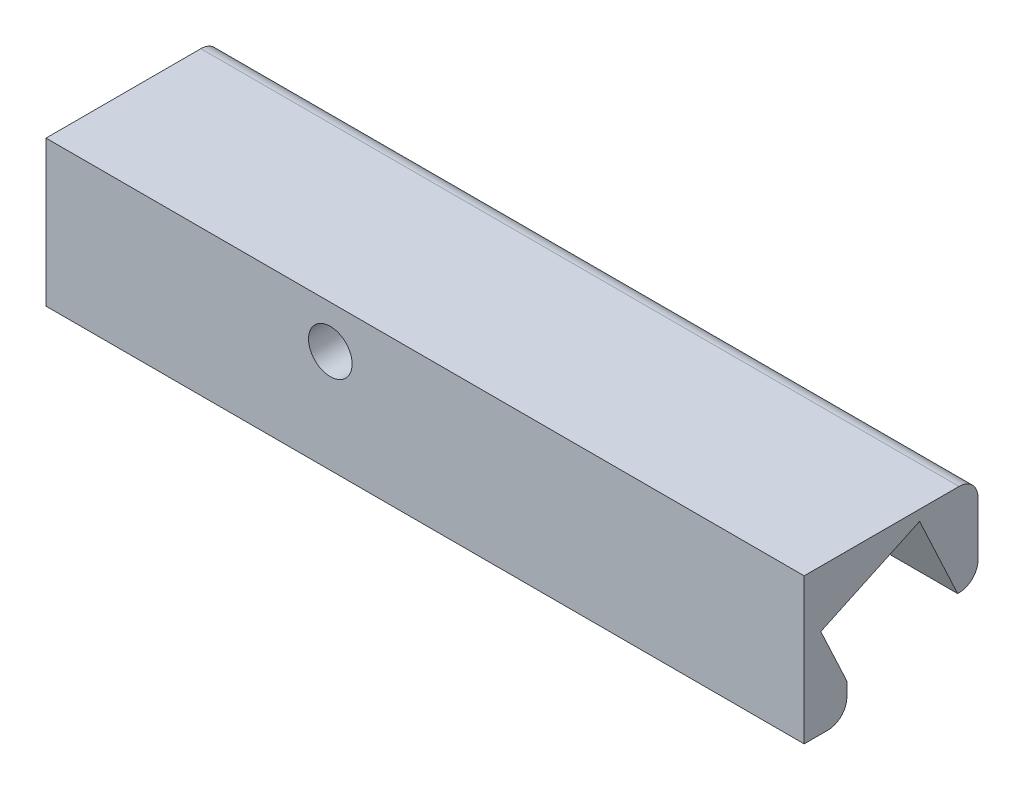
ISO-10303-21;
HEADER;
FILE_DESCRIPTION(('STEP AP214'),'2;1');
FILE_NAME('part.step','',(''),(''),'','','');
FILE_SCHEMA(('AUTOMOTIVE_DESIGN { 1 0 10303 214 1 1 1 1 }'));
ENDSEC;
DATA;
#1=APPLICATION_CONTEXT('core data for automotive mechanical design processes');
#2=APPLICATION_PROTOCOL_DEFINITION('international standard','automotive_design',2000,#1);
#3=PRODUCT_CONTEXT('',#1,'mechanical');
#4=PRODUCT('Part','Part','',(#3));
#5=PRODUCT_RELATED_PRODUCT_CATEGORY('part','',(#4));
#6=PRODUCT_DEFINITION_FORMATION('','',#4);
#7=PRODUCT_DEFINITION_CONTEXT('part definition',#1,'design');
#8=PRODUCT_DEFINITION('design','',#6,#7);
#9=PRODUCT_DEFINITION_SHAPE('','',#8);
#10=(LENGTH_UNIT() NAMED_UNIT(*) SI_UNIT(.MILLI.,.METRE.));
#11=(NAMED_UNIT(*) PLANE_ANGLE_UNIT() SI_UNIT($,.RADIAN.));
#12=(NAMED_UNIT(*) SI_UNIT($,.STERADIAN.) SOLID_ANGLE_UNIT());
#13=UNCERTAINTY_MEASURE_WITH_UNIT(LENGTH_MEASURE(1.E-05),#10,'distance_accuracy_value','');
#14=(GEOMETRIC_REPRESENTATION_CONTEXT(3) GLOBAL_UNCERTAINTY_ASSIGNED_CONTEXT((#13)) GLOBAL_UNIT_ASSIGNED_CONTEXT((#10,
#11,#12)) REPRESENTATION_CONTEXT('',''));
#15=CARTESIAN_POINT('',(0.,0.,0.));
#16=DIRECTION('',(0.,0.,1.));
#17=DIRECTION('',(1.,0.,0.));
#18=AXIS2_PLACEMENT_3D('',#15,#16,#17);
#19=CARTESIAN_POINT('',(80.,15.360110010018,0.));
#20=DIRECTION('',(0.,0.,-1.));
#21=DIRECTION('',(0.,1.,0.));
#22=AXIS2_PLACEMENT_3D('',#19,#20,#21);
#23=PLANE('',#22);
#24=CARTESIAN_POINT('',(30.,10.860110010018,0.));
#25=DIRECTION('',(0.,0.,1.));
#26=DIRECTION('',(1.,0.,0.));
#27=AXIS2_PLACEMENT_3D('',#24,#25,#26);
#28=CIRCLE('',#27,2.3);
#29=CARTESIAN_POINT('',(32.3,10.860110010018,0.));
#30=VERTEX_POINT('',#29);
#31=EDGE_CURVE('E246',#30,#30,#28,.T.);
#32=ORIENTED_EDGE('',*,*,#31,.F.);
#33=EDGE_LOOP('',(#32));
#34=FACE_BOUND('',#33,.T.);
#35=DIRECTION('',(0.,-1.,0.));
#36=VECTOR('',#35,1.);
#37=CARTESIAN_POINT('',(0.,15.360110010018,0.));
#38=LINE('',#37,#36);
#39=CARTESIAN_POINT('',(0.,15.360110010018,0.));
#40=VERTEX_POINT('',#39);
#41=CARTESIAN_POINT('',(0.,0.,0.));
#42=VERTEX_POINT('',#41);
#43=EDGE_CURVE('E153',#40,#42,#38,.T.);
#44=ORIENTED_EDGE('',*,*,#43,.T.);
#45=DIRECTION('',(-1.,0.,0.));
#46=VECTOR('',#45,1.);
#47=CARTESIAN_POINT('',(80.,0.,0.));
#48=LINE('',#47,#46);
#49=CARTESIAN_POINT('',(80.,0.,0.));
#50=VERTEX_POINT('',#49);
#51=EDGE_CURVE('E11',#50,#42,#48,.T.);
#52=ORIENTED_EDGE('',*,*,#51,.F.);
#53=DIRECTION('',(0.,-1.,0.));
#54=VECTOR('',#53,1.);
#55=CARTESIAN_POINT('',(80.,15.360110010018,0.));
#56=LINE('',#55,#54);
#57=CARTESIAN_POINT('',(80.,15.360110010018,0.));
#58=VERTEX_POINT('',#57);
#59=EDGE_CURVE('E175',#58,#50,#56,.T.);
#60=ORIENTED_EDGE('',*,*,#59,.F.);
#61=DIRECTION('',(-1.,0.,0.));
#62=VECTOR('',#61,1.);
#63=CARTESIAN_POINT('',(80.,15.360110010018,0.));
#64=LINE('',#63,#62);
#65=EDGE_CURVE('E149',#58,#40,#64,.T.);
#66=ORIENTED_EDGE('',*,*,#65,.T.);
#67=EDGE_LOOP('',(#44,#52,#60,#66));
#68=FACE_BOUND('',#67,.T.);
#69=ADVANCED_FACE('F39',(#34,#68),#23,.F.);
#70=CARTESIAN_POINT('',(80.,0.,0.));
#71=DIRECTION('',(0.,1.,0.));
#72=DIRECTION('',(0.,0.,1.));
#73=AXIS2_PLACEMENT_3D('',#70,#71,#72);
#74=PLANE('',#73);
#75=DIRECTION('',(0.,0.,-1.));
#76=VECTOR('',#75,1.);
#77=CARTESIAN_POINT('',(0.,0.,0.));
#78=LINE('',#77,#76);
#79=CARTESIAN_POINT('',(0.,0.,-2.4994615533352));
#80=VERTEX_POINT('',#79);
#81=EDGE_CURVE('E156',#42,#80,#78,.T.);
#82=ORIENTED_EDGE('',*,*,#81,.T.);
#83=DIRECTION('',(-1.,0.,0.));
#84=VECTOR('',#83,1.);
#85=CARTESIAN_POINT('',(80.,0.,-2.4994615533352));
#86=LINE('',#85,#84);
#87=CARTESIAN_POINT('',(80.,0.,-2.4994615533352));
#88=VERTEX_POINT('',#87);
#89=EDGE_CURVE('E46',#88,#80,#86,.T.);
#90=ORIENTED_EDGE('',*,*,#89,.F.);
#91=DIRECTION('',(0.,0.,-1.));
#92=VECTOR('',#91,1.);
#93=CARTESIAN_POINT('',(80.,0.,0.));
#94=LINE('',#93,#92);
#95=EDGE_CURVE('E109',#50,#88,#94,.T.);
#96=ORIENTED_EDGE('',*,*,#95,.F.);
#97=ORIENTED_EDGE('',*,*,#51,.T.);
#98=EDGE_LOOP('',(#82,#90,#96,#97));
#99=FACE_BOUND('',#98,.T.);
#100=ADVANCED_FACE('F263',(#99),#74,.F.);
#101=CARTESIAN_POINT('',(80.,2.0005384466648,-2.4994615533352));
#102=DIRECTION('',(-1.,0.,0.));
#103=DIRECTION('',(0.,0.,1.));
#104=AXIS2_PLACEMENT_3D('',#101,#102,#103);
#105=CYLINDRICAL_SURFACE('',#104,2.0005384466648);
#106=CARTESIAN_POINT('',(0.,2.0005384466648,-2.4994615533352));
#107=DIRECTION('',(1.,0.,0.));
#108=DIRECTION('',(0.,0.,-1.));
#109=AXIS2_PLACEMENT_3D('',#106,#107,#108);
#110=CIRCLE('',#109,2.0005384466648);
#111=CARTESIAN_POINT('',(0.,2.0005384466648,-4.5));
#112=VERTEX_POINT('',#111);
#113=EDGE_CURVE('E159',#80,#112,#110,.T.);
#114=ORIENTED_EDGE('',*,*,#113,.T.);
#115=DIRECTION('',(-1.,0.,0.));
#116=VECTOR('',#115,1.);
#117=CARTESIAN_POINT('',(80.,2.0005384466648,-4.5));
#118=LINE('',#117,#116);
#119=CARTESIAN_POINT('',(80.,2.0005384466648,-4.5));
#120=VERTEX_POINT('',#119);
#121=EDGE_CURVE('E188',#120,#112,#118,.T.);
#122=ORIENTED_EDGE('',*,*,#121,.F.);
#123=CARTESIAN_POINT('',(80.,2.0005384466648,-2.4994615533352));
#124=DIRECTION('',(1.,0.,0.));
#125=DIRECTION('',(0.,0.,-1.));
#126=AXIS2_PLACEMENT_3D('',#123,#124,#125);
#127=CIRCLE('',#126,2.0005384466648);
#128=EDGE_CURVE('E196',#88,#120,#127,.T.);
#129=ORIENTED_EDGE('',*,*,#128,.F.);
#130=ORIENTED_EDGE('',*,*,#89,.T.);
#131=EDGE_LOOP('',(#114,#122,#129,#130));
#132=FACE_BOUND('',#131,.T.);
#133=ADVANCED_FACE('F194',(#132),#105,.T.);
#134=CARTESIAN_POINT('',(80.,3.5,-4.5));
#135=DIRECTION('',(0.,0.,1.));
#136=DIRECTION('',(0.,-1.,0.));
#137=AXIS2_PLACEMENT_3D('',#134,#135,#136);
#138=PLANE('',#137);
#139=DIRECTION('',(0.,1.,0.));
#140=VECTOR('',#139,1.);
#141=CARTESIAN_POINT('',(0.,3.5,-4.5));
#142=LINE('',#141,#140);
#143=CARTESIAN_POINT('',(0.,3.5,-4.5));
#144=VERTEX_POINT('',#143);
#145=EDGE_CURVE('E161',#112,#144,#142,.T.);
#146=ORIENTED_EDGE('',*,*,#145,.T.);
#147=DIRECTION('',(-1.,0.,0.));
#148=VECTOR('',#147,1.);
#149=CARTESIAN_POINT('',(80.,3.5,-4.5));
#150=LINE('',#149,#148);
#151=CARTESIAN_POINT('',(52.,3.5,-4.5));
#152=VERTEX_POINT('',#151);
#153=EDGE_CURVE('E184',#152,#144,#150,.T.);
#154=ORIENTED_EDGE('',*,*,#153,.F.);
#155=CARTESIAN_POINT('',(80.,3.5,-4.5));
#156=VERTEX_POINT('',#155);
#157=EDGE_CURVE('E185',#156,#152,#150,.T.);
#158=ORIENTED_EDGE('',*,*,#157,.F.);
#159=DIRECTION('',(0.,1.,0.));
#160=VECTOR('',#159,1.);
#161=CARTESIAN_POINT('',(80.,3.5,-4.5));
#162=LINE('',#161,#160);
#163=EDGE_CURVE('E209',#120,#156,#162,.T.);
#164=ORIENTED_EDGE('',*,*,#163,.F.);
#165=ORIENTED_EDGE('',*,*,#121,.T.);
#166=EDGE_LOOP('',(#146,#154,#158,#164,#165));
#167=FACE_BOUND('',#166,.T.);
#168=ADVANCED_FACE('F205',(#167),#138,.F.);
#169=CARTESIAN_POINT('',(80.,8.36011001001802,-14.9225395509215));
#170=DIRECTION('',(0.,0.906307787036651,0.422618261740697));
#171=DIRECTION('',(0.,-0.422618261740697,0.906307787036651));
#172=AXIS2_PLACEMENT_3D('',#169,#170,#171);
#173=PLANE('',#172);
#174=CARTESIAN_POINT('',(43.85,5.93005500500901,-9.71126977546074));
#175=DIRECTION('',(0.,-0.906307787036651,-0.422618261740697));
#176=DIRECTION('',(0.,0.422618261740697,-0.906307787036651));
#177=AXIS2_PLACEMENT_3D('',#174,#175,#176);
#178=CIRCLE('',#177,2.30000000000001);
#179=CARTESIAN_POINT('',(43.85,6.90207700701262,-11.795777685645));
#180=VERTEX_POINT('',#179);
#181=EDGE_CURVE('E217',#180,#180,#178,.T.);
#182=ORIENTED_EDGE('',*,*,#181,.F.);
#183=EDGE_LOOP('',(#182));
#184=FACE_BOUND('',#183,.T.);
#185=DIRECTION('',(-1.,0.,0.));
#186=VECTOR('',#185,1.);
#187=CARTESIAN_POINT('',(80.,8.36011001001802,-14.9225395509215));
#188=LINE('',#187,#186);
#189=CARTESIAN_POINT('',(52.,8.36011001001802,-14.9225395509215));
#190=VERTEX_POINT('',#189);
#191=CARTESIAN_POINT('',(0.,8.36011001001802,-14.9225395509215));
#192=VERTEX_POINT('',#191);
#193=EDGE_CURVE('E182',#190,#192,#188,.T.);
#194=ORIENTED_EDGE('',*,*,#193,.F.);
#195=DIRECTION('',(0.,0.422618261740697,-0.906307787036651));
#196=VECTOR('',#195,1.);
#197=CARTESIAN_POINT('',(52.,3.5,-4.5));
#198=LINE('',#197,#196);
#199=EDGE_CURVE('E232',#152,#190,#198,.T.);
#200=ORIENTED_EDGE('',*,*,#199,.F.);
#201=ORIENTED_EDGE('',*,*,#153,.T.);
#202=DIRECTION('',(0.,0.422618261740697,-0.906307787036651));
#203=VECTOR('',#202,1.);
#204=CARTESIAN_POINT('',(0.,8.36011001001802,-14.9225395509215));
#205=LINE('',#204,#203);
#206=EDGE_CURVE('E164',#144,#192,#205,.T.);
#207=ORIENTED_EDGE('',*,*,#206,.T.);
#208=EDGE_LOOP('',(#194,#200,#201,#207));
#209=FACE_BOUND('',#208,.T.);
#210=ADVANCED_FACE('F288',(#184,#209),#173,.F.);
#211=CARTESIAN_POINT('',(80.,5.64118664890806,-16.1903943361436));
#212=DIRECTION('',(0.,0.422618261740698,-0.906307787036651));
#213=DIRECTION('',(0.,0.906307787036651,0.422618261740698));
#214=AXIS2_PLACEMENT_3D('',#211,#212,#213);
#215=PLANE('',#214);
#216=DIRECTION('',(0.,-0.906307787036651,-0.422618261740698));
#217=VECTOR('',#216,1.);
#218=CARTESIAN_POINT('',(0.,5.64118664890806,-16.1903943361436));
#219=LINE('',#218,#217);
#220=CARTESIAN_POINT('',(0.,5.64118664890806,-16.1903943361436));
#221=VERTEX_POINT('',#220);
#222=EDGE_CURVE('E167',#192,#221,#219,.T.);
#223=ORIENTED_EDGE('',*,*,#222,.T.);
#224=DIRECTION('',(-1.,0.,0.));
#225=VECTOR('',#224,1.);
#226=CARTESIAN_POINT('',(80.,5.64118664890806,-16.1903943361436));
#227=LINE('',#226,#225);
#228=CARTESIAN_POINT('',(80.,5.64118664890806,-16.1903943361436));
#229=VERTEX_POINT('',#228);
#230=EDGE_CURVE('E179',#229,#221,#227,.T.);
#231=ORIENTED_EDGE('',*,*,#230,.F.);
#232=DIRECTION('',(0.,-0.906307787036651,-0.422618261740698));
#233=VECTOR('',#232,1.);
#234=CARTESIAN_POINT('',(80.,5.64118664890806,-16.1903943361436));
#235=LINE('',#234,#233);
#236=CARTESIAN_POINT('',(80.,14.2511106257563,-12.175520849607));
#237=VERTEX_POINT('',#236);
#238=EDGE_CURVE('E53',#237,#229,#235,.T.);
#239=ORIENTED_EDGE('',*,*,#238,.F.);
#240=DIRECTION('',(1.,0.,0.));
#241=VECTOR('',#240,1.);
#242=CARTESIAN_POINT('',(52.,14.2511106257563,-12.175520849607));
#243=LINE('',#242,#241);
#244=CARTESIAN_POINT('',(52.,14.2511106257563,-12.175520849607));
#245=VERTEX_POINT('',#244);
#246=EDGE_CURVE('E242',#245,#237,#243,.T.);
#247=ORIENTED_EDGE('',*,*,#246,.F.);
#248=DIRECTION('',(0.,-0.906307787036651,-0.422618261740697));
#249=VECTOR('',#248,1.);
#250=CARTESIAN_POINT('',(52.,14.2511106257563,-12.175520849607));
#251=LINE('',#250,#249);
#252=EDGE_CURVE('E223',#245,#190,#251,.T.);
#253=ORIENTED_EDGE('',*,*,#252,.T.);
#254=ORIENTED_EDGE('',*,*,#193,.T.);
#255=EDGE_LOOP('',(#223,#231,#239,#247,#253,#254));
#256=FACE_BOUND('',#255,.T.);
#257=ADVANCED_FACE('F284',(#256),#215,.F.);
#258=CARTESIAN_POINT('',(80.,7.63552847711335,-16.3407295358501));
#259=DIRECTION('',(-1.,0.,0.));
#260=DIRECTION('',(0.,0.,1.));
#261=AXIS2_PLACEMENT_3D('',#258,#259,#260);
#262=CYLINDRICAL_SURFACE('',#261,2.);
#263=CARTESIAN_POINT('',(0.,7.63552847711335,-16.3407295358501));
#264=DIRECTION('',(1.,0.,0.));
#265=DIRECTION('',(0.,0.,-1.));
#266=AXIS2_PLACEMENT_3D('',#263,#264,#265);
#267=CIRCLE('',#266,2.);
#268=CARTESIAN_POINT('',(0.,7.63552847711335,-18.3407295358501));
#269=VERTEX_POINT('',#268);
#270=EDGE_CURVE('E169',#221,#269,#267,.T.);
#271=ORIENTED_EDGE('',*,*,#270,.T.);
#272=DIRECTION('',(-1.,0.,0.));
#273=VECTOR('',#272,1.);
#274=CARTESIAN_POINT('',(80.,7.63552847711335,-18.3407295358501));
#275=LINE('',#274,#273);
#276=CARTESIAN_POINT('',(80.,7.63552847711335,-18.3407295358501));
#277=VERTEX_POINT('',#276);
#278=EDGE_CURVE('E144',#277,#269,#275,.T.);
#279=ORIENTED_EDGE('',*,*,#278,.F.);
#280=CARTESIAN_POINT('',(80.,7.63552847711335,-16.3407295358501));
#281=DIRECTION('',(1.,0.,0.));
#282=DIRECTION('',(0.,0.,-1.));
#283=AXIS2_PLACEMENT_3D('',#280,#281,#282);
#284=CIRCLE('',#283,2.);
#285=EDGE_CURVE('E132',#229,#277,#284,.T.);
#286=ORIENTED_EDGE('',*,*,#285,.F.);
#287=ORIENTED_EDGE('',*,*,#230,.T.);
#288=EDGE_LOOP('',(#271,#279,#286,#287));
#289=FACE_BOUND('',#288,.T.);
#290=ADVANCED_FACE('F281',(#289),#262,.T.);
#291=CARTESIAN_POINT('',(80.,7.63552847711335,-18.3407295358501));
#292=DIRECTION('',(0.,0.,1.));
#293=DIRECTION('',(0.,-1.,0.));
#294=AXIS2_PLACEMENT_3D('',#291,#292,#293);
#295=PLANE('',#294);
#296=DIRECTION('',(0.,1.,0.));
#297=VECTOR('',#296,1.);
#298=CARTESIAN_POINT('',(0.,7.63552847711335,-18.3407295358501));
#299=LINE('',#298,#297);
#300=CARTESIAN_POINT('',(0.,13.360110010018,-18.3407295358501));
#301=VERTEX_POINT('',#300);
#302=EDGE_CURVE('E141',#269,#301,#299,.T.);
#303=ORIENTED_EDGE('',*,*,#302,.T.);
#304=DIRECTION('',(-1.,0.,0.));
#305=VECTOR('',#304,1.);
#306=CARTESIAN_POINT('',(80.,13.360110010018,-18.3407295358501));
#307=LINE('',#306,#305);
#308=CARTESIAN_POINT('',(80.,13.360110010018,-18.3407295358501));
#309=VERTEX_POINT('',#308);
#310=EDGE_CURVE('E138',#309,#301,#307,.T.);
#311=ORIENTED_EDGE('',*,*,#310,.F.);
#312=DIRECTION('',(0.,1.,0.));
#313=VECTOR('',#312,1.);
#314=CARTESIAN_POINT('',(80.,7.63552847711335,-18.3407295358501));
#315=LINE('',#314,#313);
#316=EDGE_CURVE('E124',#277,#309,#315,.T.);
#317=ORIENTED_EDGE('',*,*,#316,.F.);
#318=ORIENTED_EDGE('',*,*,#278,.T.);
#319=EDGE_LOOP('',(#303,#311,#317,#318));
#320=FACE_BOUND('',#319,.T.);
#321=ADVANCED_FACE('F139',(#320),#295,.F.);
#322=CARTESIAN_POINT('',(80.,13.360110010018,-16.3407295358501));
#323=DIRECTION('',(-1.,0.,0.));
#324=DIRECTION('',(0.,0.,1.));
#325=AXIS2_PLACEMENT_3D('',#322,#323,#324);
#326=CYLINDRICAL_SURFACE('',#325,2.);
#327=CARTESIAN_POINT('',(0.,13.360110010018,-16.3407295358501));
#328=DIRECTION('',(1.,0.,0.));
#329=DIRECTION('',(0.,0.,1.));
#330=AXIS2_PLACEMENT_3D('',#327,#328,#329);
#331=CIRCLE('',#330,2.);
#332=CARTESIAN_POINT('',(0.,15.360110010018,-16.3407295358501));
#333=VERTEX_POINT('',#332);
#334=EDGE_CURVE('E172',#301,#333,#331,.T.);
#335=ORIENTED_EDGE('',*,*,#334,.T.);
#336=DIRECTION('',(-1.,0.,0.));
#337=VECTOR('',#336,1.);
#338=CARTESIAN_POINT('',(80.,15.360110010018,-16.3407295358501));
#339=LINE('',#338,#337);
#340=CARTESIAN_POINT('',(80.,15.360110010018,-16.3407295358501));
#341=VERTEX_POINT('',#340);
#342=EDGE_CURVE('E145',#341,#333,#339,.T.);
#343=ORIENTED_EDGE('',*,*,#342,.F.);
#344=CARTESIAN_POINT('',(80.,13.360110010018,-16.3407295358501));
#345=DIRECTION('',(1.,0.,0.));
#346=DIRECTION('',(0.,0.,1.));
#347=AXIS2_PLACEMENT_3D('',#344,#345,#346);
#348=CIRCLE('',#347,2.);
#349=EDGE_CURVE('E129',#309,#341,#348,.T.);
#350=ORIENTED_EDGE('',*,*,#349,.F.);
#351=ORIENTED_EDGE('',*,*,#310,.T.);
#352=EDGE_LOOP('',(#335,#343,#350,#351));
#353=FACE_BOUND('',#352,.T.);
#354=ADVANCED_FACE('F147',(#353),#326,.T.);
#355=CARTESIAN_POINT('',(80.,15.360110010018,-16.3407295358501));
#356=DIRECTION('',(0.,-1.,0.));
#357=DIRECTION('',(0.,0.,-1.));
#358=AXIS2_PLACEMENT_3D('',#355,#356,#357);
#359=PLANE('',#358);
#360=DIRECTION('',(0.,0.,1.));
#361=VECTOR('',#360,1.);
#362=CARTESIAN_POINT('',(0.,15.360110010018,-16.3407295358501));
#363=LINE('',#362,#361);
#364=EDGE_CURVE('E101',#333,#40,#363,.T.);
#365=ORIENTED_EDGE('',*,*,#364,.T.);
#366=ORIENTED_EDGE('',*,*,#65,.F.);
#367=DIRECTION('',(0.,0.,1.));
#368=VECTOR('',#367,1.);
#369=CARTESIAN_POINT('',(80.,15.360110010018,-16.3407295358501));
#370=LINE('',#369,#368);
#371=EDGE_CURVE('E62',#341,#58,#370,.T.);
#372=ORIENTED_EDGE('',*,*,#371,.F.);
#373=ORIENTED_EDGE('',*,*,#342,.T.);
#374=EDGE_LOOP('',(#365,#366,#372,#373));
#375=FACE_BOUND('',#374,.T.);
#376=ADVANCED_FACE('F267',(#375),#359,.F.);
#377=CARTESIAN_POINT('',(80.,2.0005384466648,-2.4994615533352));
#378=DIRECTION('',(1.,0.,0.));
#379=DIRECTION('',(0.,0.,-1.));
#380=AXIS2_PLACEMENT_3D('',#377,#378,#379);
#381=PLANE('',#380);
#382=DIRECTION('',(0.,-0.906307787036651,-0.422618261740697));
#383=VECTOR('',#382,1.);
#384=CARTESIAN_POINT('',(80.,9.39100061573824,-1.75298129868547));
#385=LINE('',#384,#383);
#386=CARTESIAN_POINT('',(80.,9.39100061573824,-1.75298129868547));
#387=VERTEX_POINT('',#386);
#388=EDGE_CURVE('E226',#387,#156,#385,.T.);
#389=ORIENTED_EDGE('',*,*,#388,.F.);
#390=DIRECTION('',(0.,-0.422618261740697,0.906307787036651));
#391=VECTOR('',#390,1.);
#392=CARTESIAN_POINT('',(80.,9.39100061573824,-1.75298129868547));
#393=LINE('',#392,#391);
#394=EDGE_CURVE('E239',#237,#387,#393,.T.);
#395=ORIENTED_EDGE('',*,*,#394,.F.);
#396=ORIENTED_EDGE('',*,*,#238,.T.);
#397=ORIENTED_EDGE('',*,*,#285,.T.);
#398=ORIENTED_EDGE('',*,*,#316,.T.);
#399=ORIENTED_EDGE('',*,*,#349,.T.);
#400=ORIENTED_EDGE('',*,*,#371,.T.);
#401=ORIENTED_EDGE('',*,*,#59,.T.);
#402=ORIENTED_EDGE('',*,*,#95,.T.);
#403=ORIENTED_EDGE('',*,*,#128,.T.);
#404=ORIENTED_EDGE('',*,*,#163,.T.);
#405=EDGE_LOOP('',(#389,#395,#396,#397,#398,#399,#400,#401,#402,#403,#404));
#406=FACE_BOUND('',#405,.T.);
#407=ADVANCED_FACE('F127',(#406),#381,.T.);
#408=CARTESIAN_POINT('',(0.,2.0005384466648,-2.4994615533352));
#409=DIRECTION('',(1.,0.,0.));
#410=DIRECTION('',(0.,0.,-1.));
#411=AXIS2_PLACEMENT_3D('',#408,#409,#410);
#412=PLANE('',#411);
#413=ORIENTED_EDGE('',*,*,#43,.F.);
#414=ORIENTED_EDGE('',*,*,#364,.F.);
#415=ORIENTED_EDGE('',*,*,#334,.F.);
#416=ORIENTED_EDGE('',*,*,#302,.F.);
#417=ORIENTED_EDGE('',*,*,#270,.F.);
#418=ORIENTED_EDGE('',*,*,#222,.F.);
#419=ORIENTED_EDGE('',*,*,#206,.F.);
#420=ORIENTED_EDGE('',*,*,#145,.F.);
#421=ORIENTED_EDGE('',*,*,#113,.F.);
#422=ORIENTED_EDGE('',*,*,#81,.F.);
#423=EDGE_LOOP('',(#413,#414,#415,#416,#417,#418,#419,#420,#421,#422));
#424=FACE_BOUND('',#423,.T.);
#425=ADVANCED_FACE('F200',(#424),#412,.F.);
#426=CARTESIAN_POINT('',(43.85,10.0084400466739,-7.80948759762761));
#427=DIRECTION('',(0.,-0.906307787036651,-0.422618261740697));
#428=DIRECTION('',(0.,0.422618261740697,-0.906307787036651));
#429=AXIS2_PLACEMENT_3D('',#426,#427,#428);
#430=CYLINDRICAL_SURFACE('',#429,2.30000000000001);
#431=CARTESIAN_POINT('',(43.85,10.0084400466739,-7.80948759762761));
#432=DIRECTION('',(0.,-0.906307787036651,-0.422618261740697));
#433=DIRECTION('',(0.,0.422618261740697,-0.906307787036651));
#434=AXIS2_PLACEMENT_3D('',#431,#432,#433);
#435=CIRCLE('',#434,2.30000000000001);
#436=CARTESIAN_POINT('',(43.85,10.9804620486776,-9.89399550781191));
#437=VERTEX_POINT('',#436);
#438=EDGE_CURVE('E157',#437,#437,#435,.T.);
#439=ORIENTED_EDGE('',*,*,#438,.F.);
#440=EDGE_LOOP('',(#439));
#441=FACE_BOUND('',#440,.T.);
#442=ORIENTED_EDGE('',*,*,#181,.T.);
#443=EDGE_LOOP('',(#442));
#444=FACE_BOUND('',#443,.T.);
#445=ADVANCED_FACE('F341',(#441,#444),#430,.F.);
#446=CARTESIAN_POINT('',(43.85,10.0084400466739,-7.80948759762761));
#447=DIRECTION('',(0.,-0.906307787036651,-0.422618261740697));
#448=DIRECTION('',(0.,0.422618261740697,-0.906307787036651));
#449=AXIS2_PLACEMENT_3D('',#446,#447,#448);
#450=PLANE('',#449);
#451=ORIENTED_EDGE('',*,*,#438,.T.);
#452=EDGE_LOOP('',(#451));
#453=FACE_BOUND('',#452,.T.);
#454=ADVANCED_FACE('F349',(#453),#450,.T.);
#455=CARTESIAN_POINT('',(52.,9.39100061573824,-1.75298129868547));
#456=DIRECTION('',(-1.,0.,0.));
#457=DIRECTION('',(0.,0.,1.));
#458=AXIS2_PLACEMENT_3D('',#455,#456,#457);
#459=PLANE('',#458);
#460=ORIENTED_EDGE('',*,*,#199,.T.);
#461=ORIENTED_EDGE('',*,*,#252,.F.);
#462=DIRECTION('',(0.,0.422618261740697,-0.906307787036651));
#463=VECTOR('',#462,1.);
#464=CARTESIAN_POINT('',(52.,9.39100061573824,-1.75298129868547));
#465=LINE('',#464,#463);
#466=CARTESIAN_POINT('',(52.,9.39100061573824,-1.75298129868547));
#467=VERTEX_POINT('',#466);
#468=EDGE_CURVE('E235',#467,#245,#465,.T.);
#469=ORIENTED_EDGE('',*,*,#468,.F.);
#470=DIRECTION('',(0.,-0.906307787036651,-0.422618261740697));
#471=VECTOR('',#470,1.);
#472=CARTESIAN_POINT('',(52.,9.39100061573824,-1.75298129868547));
#473=LINE('',#472,#471);
#474=EDGE_CURVE('E220',#467,#152,#473,.T.);
#475=ORIENTED_EDGE('',*,*,#474,.T.);
#476=EDGE_LOOP('',(#460,#461,#469,#475));
#477=FACE_BOUND('',#476,.T.);
#478=ADVANCED_FACE('F359',(#477),#459,.F.);
#479=CARTESIAN_POINT('',(52.,9.39100061573824,-1.75298129868547));
#480=DIRECTION('',(0.,-0.422618261740697,0.906307787036651));
#481=DIRECTION('',(0.,-0.906307787036651,-0.422618261740697));
#482=AXIS2_PLACEMENT_3D('',#479,#480,#481);
#483=PLANE('',#482);
#484=ORIENTED_EDGE('',*,*,#157,.T.);
#485=ORIENTED_EDGE('',*,*,#474,.F.);
#486=DIRECTION('',(-1.,0.,0.));
#487=VECTOR('',#486,1.);
#488=CARTESIAN_POINT('',(52.,9.39100061573824,-1.75298129868547));
#489=LINE('',#488,#487);
#490=EDGE_CURVE('E227',#387,#467,#489,.T.);
#491=ORIENTED_EDGE('',*,*,#490,.F.);
#492=ORIENTED_EDGE('',*,*,#388,.T.);
#493=EDGE_LOOP('',(#484,#485,#491,#492));
#494=FACE_BOUND('',#493,.T.);
#495=ADVANCED_FACE('F376',(#494),#483,.F.);
#496=CARTESIAN_POINT('',(0.,7.04227893567199,3.28386859856746));
#497=DIRECTION('',(0.,-0.906307787036651,-0.422618261740697));
#498=DIRECTION('',(0.,0.422618261740697,-0.906307787036651));
#499=AXIS2_PLACEMENT_3D('',#496,#497,#498);
#500=PLANE('',#499);
#501=ORIENTED_EDGE('',*,*,#468,.T.);
#502=ORIENTED_EDGE('',*,*,#246,.T.);
#503=ORIENTED_EDGE('',*,*,#394,.T.);
#504=ORIENTED_EDGE('',*,*,#490,.T.);
#505=EDGE_LOOP('',(#501,#502,#503,#504));
#506=FACE_BOUND('',#505,.T.);
#507=ADVANCED_FACE('F257',(#506),#500,.T.);
#508=CARTESIAN_POINT('',(30.,10.860110010018,-4.5));
#509=DIRECTION('',(0.,0.,1.));
#510=DIRECTION('',(1.,0.,0.));
#511=AXIS2_PLACEMENT_3D('',#508,#509,#510);
#512=CYLINDRICAL_SURFACE('',#511,2.3);
#513=CARTESIAN_POINT('',(30.,10.860110010018,-4.5));
#514=DIRECTION('',(0.,0.,1.));
#515=DIRECTION('',(1.,0.,0.));
#516=AXIS2_PLACEMENT_3D('',#513,#514,#515);
#517=CIRCLE('',#516,2.3);
#518=CARTESIAN_POINT('',(32.3,10.860110010018,-4.5));
#519=VERTEX_POINT('',#518);
#520=EDGE_CURVE('E236',#519,#519,#517,.T.);
#521=ORIENTED_EDGE('',*,*,#520,.F.);
#522=EDGE_LOOP('',(#521));
#523=FACE_BOUND('',#522,.T.);
#524=ORIENTED_EDGE('',*,*,#31,.T.);
#525=EDGE_LOOP('',(#524));
#526=FACE_BOUND('',#525,.T.);
#527=ADVANCED_FACE('F254',(#523,#526),#512,.F.);
#528=CARTESIAN_POINT('',(30.,10.860110010018,-4.5));
#529=DIRECTION('',(0.,0.,1.));
#530=DIRECTION('',(1.,0.,0.));
#531=AXIS2_PLACEMENT_3D('',#528,#529,#530);
#532=PLANE('',#531);
#533=ORIENTED_EDGE('',*,*,#520,.T.);
#534=EDGE_LOOP('',(#533));
#535=FACE_BOUND('',#534,.T.);
#536=ADVANCED_FACE('F252',(#535),#532,.T.);
#537=CLOSED_SHELL('',(#69,#100,#133,#168,#210,#257,#290,#321,#354,#376,#407,#425,#445,#454,#478,
#495,#507,#527,#536));
#538=MANIFOLD_SOLID_BREP('B2',#537);
#539=ADVANCED_BREP_SHAPE_REPRESENTATION('',(#18,#538),#14);
#540=SHAPE_DEFINITION_REPRESENTATION(#9,#539);
ENDSEC;
END-ISO-10303-21;
